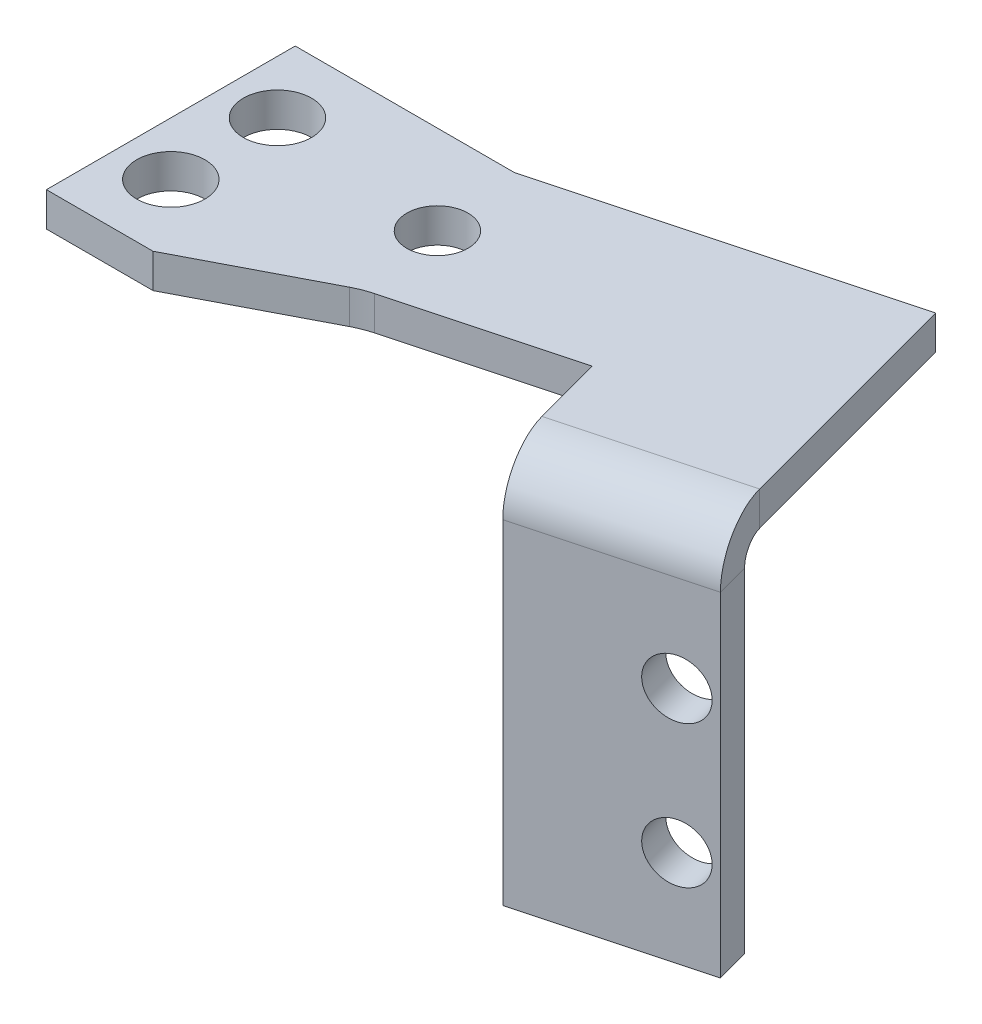
ISO-10303-21;
HEADER;
FILE_DESCRIPTION(('STEP AP214'),'2;1');
FILE_NAME('part.step','',(''),(''),'','','');
FILE_SCHEMA(('AUTOMOTIVE_DESIGN { 1 0 10303 214 1 1 1 1 }'));
ENDSEC;
DATA;
#1=APPLICATION_CONTEXT('core data for automotive mechanical design processes');
#2=APPLICATION_PROTOCOL_DEFINITION('international standard','automotive_design',2000,#1);
#3=PRODUCT_CONTEXT('',#1,'mechanical');
#4=PRODUCT('Part','Part','',(#3));
#5=PRODUCT_RELATED_PRODUCT_CATEGORY('part','',(#4));
#6=PRODUCT_DEFINITION_FORMATION('','',#4);
#7=PRODUCT_DEFINITION_CONTEXT('part definition',#1,'design');
#8=PRODUCT_DEFINITION('design','',#6,#7);
#9=PRODUCT_DEFINITION_SHAPE('','',#8);
#10=(LENGTH_UNIT() NAMED_UNIT(*) SI_UNIT(.MILLI.,.METRE.));
#11=(NAMED_UNIT(*) PLANE_ANGLE_UNIT() SI_UNIT($,.RADIAN.));
#12=(NAMED_UNIT(*) SI_UNIT($,.STERADIAN.) SOLID_ANGLE_UNIT());
#13=UNCERTAINTY_MEASURE_WITH_UNIT(LENGTH_MEASURE(1.E-05),#10,'distance_accuracy_value','');
#14=(GEOMETRIC_REPRESENTATION_CONTEXT(3) GLOBAL_UNCERTAINTY_ASSIGNED_CONTEXT((#13)) GLOBAL_UNIT_ASSIGNED_CONTEXT((#10,
#11,#12)) REPRESENTATION_CONTEXT('',''));
#15=CARTESIAN_POINT('',(0.,0.,0.));
#16=DIRECTION('',(0.,0.,1.));
#17=DIRECTION('',(1.,0.,0.));
#18=AXIS2_PLACEMENT_3D('',#15,#16,#17);
#19=CARTESIAN_POINT('',(17.5340084620717,-1.2192,-3.39518737433423));
#20=DIRECTION('',(0.258819045102522,0.,0.965925826289068));
#21=DIRECTION('',(0.965925826289068,0.,-0.258819045102522));
#22=AXIS2_PLACEMENT_3D('',#19,#20,#21);
#23=PLANE('',#22);
#24=DIRECTION('',(0.965925826289068,0.,-0.258819045102522));
#25=VECTOR('',#24,1.);
#26=CARTESIAN_POINT('',(17.5340084620717,-1.2192,-3.39518737433423));
#27=LINE('',#26,#25);
#28=CARTESIAN_POINT('',(5.26675046820051,-1.2192,-0.108185501532209));
#29=VERTEX_POINT('',#28);
#30=CARTESIAN_POINT('',(11.4003794651361,-1.21919999999999,-1.75168643793322));
#31=VERTEX_POINT('',#30);
#32=EDGE_CURVE('E140',#29,#31,#27,.T.);
#33=ORIENTED_EDGE('',*,*,#32,.T.);
#34=DIRECTION('',(0.,1.,0.));
#35=VECTOR('',#34,1.);
#36=CARTESIAN_POINT('',(11.4003794651361,-1.21919999999999,-1.75168643793322));
#37=LINE('',#36,#35);
#38=CARTESIAN_POINT('',(11.4003794651361,0.,-1.75168643793322));
#39=VERTEX_POINT('',#38);
#40=EDGE_CURVE('E232',#31,#39,#37,.T.);
#41=ORIENTED_EDGE('',*,*,#40,.T.);
#42=DIRECTION('',(0.965925826289068,0.,-0.258819045102522));
#43=VECTOR('',#42,1.);
#44=CARTESIAN_POINT('',(17.5340084620717,0.,-3.39518737433423));
#45=LINE('',#44,#43);
#46=CARTESIAN_POINT('',(5.26675046820051,0.,-0.108185501532209));
#47=VERTEX_POINT('',#46);
#48=EDGE_CURVE('E142',#47,#39,#45,.T.);
#49=ORIENTED_EDGE('',*,*,#48,.F.);
#50=DIRECTION('',(0.,1.,0.));
#51=VECTOR('',#50,1.);
#52=CARTESIAN_POINT('',(5.26675046820051,-1.2192,-0.108185501532209));
#53=LINE('',#52,#51);
#54=EDGE_CURVE('E138',#29,#47,#53,.T.);
#55=ORIENTED_EDGE('',*,*,#54,.F.);
#56=EDGE_LOOP('',(#33,#41,#49,#55));
#57=FACE_BOUND('',#56,.T.);
#58=ADVANCED_FACE('F61',(#57),#23,.T.);
#59=CARTESIAN_POINT('',(4.02700332016001,-1.2192,-6.35));
#60=DIRECTION('',(0.,0.,-1.));
#61=DIRECTION('',(-1.,0.,0.));
#62=AXIS2_PLACEMENT_3D('',#59,#60,#61);
#63=PLANE('',#62);
#64=DIRECTION('',(-1.,0.,0.));
#65=VECTOR('',#64,1.);
#66=CARTESIAN_POINT('',(4.02700332016001,0.,-6.35));
#67=LINE('',#66,#65);
#68=CARTESIAN_POINT('',(4.02700332016001,0.,-6.35));
#69=VERTEX_POINT('',#68);
#70=CARTESIAN_POINT('',(-3.81,0.,-6.35));
#71=VERTEX_POINT('',#70);
#72=EDGE_CURVE('E172',#69,#71,#67,.T.);
#73=ORIENTED_EDGE('',*,*,#72,.F.);
#74=DIRECTION('',(0.,1.,0.));
#75=VECTOR('',#74,1.);
#76=CARTESIAN_POINT('',(4.02700332016001,-1.2192,-6.35));
#77=LINE('',#76,#75);
#78=CARTESIAN_POINT('',(4.02700332016001,-1.2192,-6.35));
#79=VERTEX_POINT('',#78);
#80=EDGE_CURVE('E13',#79,#69,#77,.T.);
#81=ORIENTED_EDGE('',*,*,#80,.F.);
#82=DIRECTION('',(-1.,0.,0.));
#83=VECTOR('',#82,1.);
#84=CARTESIAN_POINT('',(4.02700332016001,-1.2192,-6.35));
#85=LINE('',#84,#83);
#86=CARTESIAN_POINT('',(-3.81,-1.2192,-6.35));
#87=VERTEX_POINT('',#86);
#88=EDGE_CURVE('E193',#79,#87,#85,.T.);
#89=ORIENTED_EDGE('',*,*,#88,.T.);
#90=DIRECTION('',(0.,1.,0.));
#91=VECTOR('',#90,1.);
#92=CARTESIAN_POINT('',(-3.81,-1.2192,-6.35));
#93=LINE('',#92,#91);
#94=EDGE_CURVE('E121',#87,#71,#93,.T.);
#95=ORIENTED_EDGE('',*,*,#94,.T.);
#96=EDGE_LOOP('',(#73,#81,#89,#95));
#97=FACE_BOUND('',#96,.T.);
#98=ADVANCED_FACE('F63',(#97),#63,.T.);
#99=CARTESIAN_POINT('',(4.02700332016001,-1.2192,-6.35));
#100=DIRECTION('',(-0.258819045102522,0.,-0.965925826289068));
#101=DIRECTION('',(-0.965925826289068,0.,0.258819045102522));
#102=AXIS2_PLACEMENT_3D('',#99,#100,#101);
#103=PLANE('',#102);
#104=DIRECTION('',(-0.965925826289068,0.,0.258819045102522));
#105=VECTOR('',#104,1.);
#106=CARTESIAN_POINT('',(4.02700332016001,0.,-6.35));
#107=LINE('',#106,#105);
#108=CARTESIAN_POINT('',(15.8905075256707,0.,-9.52881637126982));
#109=VERTEX_POINT('',#108);
#110=EDGE_CURVE('E191',#109,#69,#107,.T.);
#111=ORIENTED_EDGE('',*,*,#110,.F.);
#112=DIRECTION('',(0.,1.,0.));
#113=VECTOR('',#112,1.);
#114=CARTESIAN_POINT('',(15.8905075256707,-1.2192,-9.52881637126982));
#115=LINE('',#114,#113);
#116=CARTESIAN_POINT('',(15.8905075256707,-1.2192,-9.52881637126982));
#117=VERTEX_POINT('',#116);
#118=EDGE_CURVE('E70',#117,#109,#115,.T.);
#119=ORIENTED_EDGE('',*,*,#118,.F.);
#120=DIRECTION('',(-0.965925826289068,0.,0.258819045102522));
#121=VECTOR('',#120,1.);
#122=CARTESIAN_POINT('',(4.02700332016001,-1.2192,-6.35));
#123=LINE('',#122,#121);
#124=EDGE_CURVE('E170',#117,#79,#123,.T.);
#125=ORIENTED_EDGE('',*,*,#124,.T.);
#126=ORIENTED_EDGE('',*,*,#80,.T.);
#127=EDGE_LOOP('',(#111,#119,#125,#126));
#128=FACE_BOUND('',#127,.T.);
#129=ADVANCED_FACE('F206',(#128),#103,.T.);
#130=CARTESIAN_POINT('',(15.8905075256707,-1.2192,-9.52881637126982));
#131=DIRECTION('',(0.965925826289068,0.,-0.258819045102522));
#132=DIRECTION('',(-0.258819045102522,0.,-0.965925826289068));
#133=AXIS2_PLACEMENT_3D('',#130,#131,#132);
#134=PLANE('',#133);
#135=DIRECTION('',(-0.258819045102522,0.,-0.965925826289068));
#136=VECTOR('',#135,1.);
#137=CARTESIAN_POINT('',(15.8905075256707,0.,-9.52881637126982));
#138=LINE('',#137,#136);
#139=CARTESIAN_POINT('',(18.1914088366321,0.,-0.941735775560001));
#140=VERTEX_POINT('',#139);
#141=EDGE_CURVE('E188',#140,#109,#138,.T.);
#142=ORIENTED_EDGE('',*,*,#141,.F.);
#143=DIRECTION('',(0.,1.,0.));
#144=VECTOR('',#143,1.);
#145=CARTESIAN_POINT('',(18.1914088366321,-1.2192,-0.941735775560002));
#146=LINE('',#145,#144);
#147=CARTESIAN_POINT('',(18.1914088366321,-1.2192,-0.941735775560002));
#148=VERTEX_POINT('',#147);
#149=EDGE_CURVE('E214',#148,#140,#146,.T.);
#150=ORIENTED_EDGE('',*,*,#149,.F.);
#151=DIRECTION('',(-0.258819045102522,0.,-0.965925826289068));
#152=VECTOR('',#151,1.);
#153=CARTESIAN_POINT('',(15.8905075256707,-1.2192,-9.52881637126982));
#154=LINE('',#153,#152);
#155=EDGE_CURVE('E159',#148,#117,#154,.T.);
#156=ORIENTED_EDGE('',*,*,#155,.T.);
#157=ORIENTED_EDGE('',*,*,#118,.T.);
#158=EDGE_LOOP('',(#142,#150,#156,#157));
#159=FACE_BOUND('',#158,.T.);
#160=ADVANCED_FACE('F211',(#159),#134,.T.);
#161=CARTESIAN_POINT('',(6.08850093640101,-1.2192,2.95862899693558));
#162=DIRECTION('',(0.,1.,0.));
#163=DIRECTION('',(0.,0.,1.));
#164=AXIS2_PLACEMENT_3D('',#161,#162,#163);
#165=CYLINDRICAL_SURFACE('',#164,3.175);
#166=CARTESIAN_POINT('',(6.08850093640101,0.,2.95862899693558));
#167=DIRECTION('',(0.,-1.,0.));
#168=DIRECTION('',(0.,0.,1.));
#169=AXIS2_PLACEMENT_3D('',#166,#167,#168);
#170=CIRCLE('',#169,3.175);
#171=CARTESIAN_POINT('',(4.62660528405092,0.,0.14020991850883));
#172=VERTEX_POINT('',#171);
#173=EDGE_CURVE('E185',#172,#47,#170,.T.);
#174=ORIENTED_EDGE('',*,*,#173,.F.);
#175=DIRECTION('',(0.,1.,0.));
#176=VECTOR('',#175,1.);
#177=CARTESIAN_POINT('',(4.62660528405092,-1.2192,0.14020991850883));
#178=LINE('',#177,#176);
#179=CARTESIAN_POINT('',(4.62660528405092,-1.2192,0.14020991850883));
#180=VERTEX_POINT('',#179);
#181=EDGE_CURVE('E147',#180,#172,#178,.T.);
#182=ORIENTED_EDGE('',*,*,#181,.F.);
#183=CARTESIAN_POINT('',(6.08850093640101,-1.2192,2.95862899693558));
#184=DIRECTION('',(0.,-1.,0.));
#185=DIRECTION('',(0.,0.,1.));
#186=AXIS2_PLACEMENT_3D('',#183,#184,#185);
#187=CIRCLE('',#186,3.175);
#188=EDGE_CURVE('E154',#180,#29,#187,.T.);
#189=ORIENTED_EDGE('',*,*,#188,.T.);
#190=ORIENTED_EDGE('',*,*,#54,.T.);
#191=EDGE_LOOP('',(#174,#182,#189,#190));
#192=FACE_BOUND('',#191,.T.);
#193=ADVANCED_FACE('F161',(#192),#165,.F.);
#194=CARTESIAN_POINT('',(0.,-1.2192,2.54));
#195=DIRECTION('',(0.460439575543336,0.,0.887691048323386));
#196=DIRECTION('',(0.887691048323386,0.,-0.460439575543336));
#197=AXIS2_PLACEMENT_3D('',#194,#195,#196);
#198=PLANE('',#197);
#199=DIRECTION('',(0.887691048323386,0.,-0.460439575543336));
#200=VECTOR('',#199,1.);
#201=CARTESIAN_POINT('',(0.,0.,2.54));
#202=LINE('',#201,#200);
#203=CARTESIAN_POINT('',(0.,0.,2.54));
#204=VERTEX_POINT('',#203);
#205=EDGE_CURVE('E182',#204,#172,#202,.T.);
#206=ORIENTED_EDGE('',*,*,#205,.F.);
#207=DIRECTION('',(0.,1.,0.));
#208=VECTOR('',#207,1.);
#209=CARTESIAN_POINT('',(0.,-1.2192,2.54));
#210=LINE('',#209,#208);
#211=CARTESIAN_POINT('',(0.,-1.2192,2.54));
#212=VERTEX_POINT('',#211);
#213=EDGE_CURVE('E197',#212,#204,#210,.T.);
#214=ORIENTED_EDGE('',*,*,#213,.F.);
#215=DIRECTION('',(0.887691048323386,0.,-0.460439575543336));
#216=VECTOR('',#215,1.);
#217=CARTESIAN_POINT('',(0.,-1.2192,2.54));
#218=LINE('',#217,#216);
#219=EDGE_CURVE('E162',#212,#180,#218,.T.);
#220=ORIENTED_EDGE('',*,*,#219,.T.);
#221=ORIENTED_EDGE('',*,*,#181,.T.);
#222=EDGE_LOOP('',(#206,#214,#220,#221));
#223=FACE_BOUND('',#222,.T.);
#224=ADVANCED_FACE('F226',(#223),#198,.T.);
#225=CARTESIAN_POINT('',(0.,-1.2192,2.54));
#226=DIRECTION('',(0.,0.,1.));
#227=DIRECTION('',(1.,0.,0.));
#228=AXIS2_PLACEMENT_3D('',#225,#226,#227);
#229=PLANE('',#228);
#230=DIRECTION('',(1.,0.,0.));
#231=VECTOR('',#230,1.);
#232=CARTESIAN_POINT('',(0.,0.,2.54));
#233=LINE('',#232,#231);
#234=CARTESIAN_POINT('',(-3.81,0.,2.54));
#235=VERTEX_POINT('',#234);
#236=EDGE_CURVE('E179',#235,#204,#233,.T.);
#237=ORIENTED_EDGE('',*,*,#236,.F.);
#238=DIRECTION('',(0.,1.,0.));
#239=VECTOR('',#238,1.);
#240=CARTESIAN_POINT('',(-3.81,-1.2192,2.54));
#241=LINE('',#240,#239);
#242=CARTESIAN_POINT('',(-3.81,-1.2192,2.54));
#243=VERTEX_POINT('',#242);
#244=EDGE_CURVE('E199',#243,#235,#241,.T.);
#245=ORIENTED_EDGE('',*,*,#244,.F.);
#246=DIRECTION('',(1.,0.,0.));
#247=VECTOR('',#246,1.);
#248=CARTESIAN_POINT('',(0.,-1.2192,2.54));
#249=LINE('',#248,#247);
#250=EDGE_CURVE('E164',#243,#212,#249,.T.);
#251=ORIENTED_EDGE('',*,*,#250,.T.);
#252=ORIENTED_EDGE('',*,*,#213,.T.);
#253=EDGE_LOOP('',(#237,#245,#251,#252));
#254=FACE_BOUND('',#253,.T.);
#255=ADVANCED_FACE('F223',(#254),#229,.T.);
#256=CARTESIAN_POINT('',(-3.81,-1.2192,-6.35));
#257=DIRECTION('',(-1.,0.,0.));
#258=DIRECTION('',(0.,0.,1.));
#259=AXIS2_PLACEMENT_3D('',#256,#257,#258);
#260=PLANE('',#259);
#261=DIRECTION('',(0.,0.,1.));
#262=VECTOR('',#261,1.);
#263=CARTESIAN_POINT('',(-3.81,0.,-6.35));
#264=LINE('',#263,#262);
#265=EDGE_CURVE('E175',#71,#235,#264,.T.);
#266=ORIENTED_EDGE('',*,*,#265,.F.);
#267=ORIENTED_EDGE('',*,*,#94,.F.);
#268=DIRECTION('',(0.,0.,1.));
#269=VECTOR('',#268,1.);
#270=CARTESIAN_POINT('',(-3.81,-1.2192,-6.35));
#271=LINE('',#270,#269);
#272=EDGE_CURVE('E216',#87,#243,#271,.T.);
#273=ORIENTED_EDGE('',*,*,#272,.T.);
#274=ORIENTED_EDGE('',*,*,#244,.T.);
#275=EDGE_LOOP('',(#266,#267,#273,#274));
#276=FACE_BOUND('',#275,.T.);
#277=ADVANCED_FACE('F200',(#276),#260,.T.);
#278=CARTESIAN_POINT('',(6.08850093640101,-1.2192,2.95862899693558));
#279=DIRECTION('',(0.,1.,0.));
#280=DIRECTION('',(0.,0.,1.));
#281=AXIS2_PLACEMENT_3D('',#278,#279,#280);
#282=PLANE('',#281);
#283=CARTESIAN_POINT('',(-1.905,-1.2192,0.));
#284=DIRECTION('',(0.,1.,0.));
#285=DIRECTION('',(0.,0.,1.));
#286=AXIS2_PLACEMENT_3D('',#283,#284,#285);
#287=CIRCLE('',#286,1.21919999999999);
#288=CARTESIAN_POINT('',(-1.905,-1.2192,1.21919999999999));
#289=VERTEX_POINT('',#288);
#290=EDGE_CURVE('E495',#289,#289,#287,.T.);
#291=ORIENTED_EDGE('',*,*,#290,.T.);
#292=EDGE_LOOP('',(#291));
#293=FACE_BOUND('',#292,.T.);
#294=CARTESIAN_POINT('',(-1.905,-1.2192,-3.81));
#295=DIRECTION('',(0.,1.,0.));
#296=DIRECTION('',(0.,0.,1.));
#297=AXIS2_PLACEMENT_3D('',#294,#295,#296);
#298=CIRCLE('',#297,1.21919999999999);
#299=CARTESIAN_POINT('',(-1.905,-1.2192,-2.59080000000001));
#300=VERTEX_POINT('',#299);
#301=EDGE_CURVE('E499',#300,#300,#298,.T.);
#302=ORIENTED_EDGE('',*,*,#301,.T.);
#303=EDGE_LOOP('',(#302));
#304=FACE_BOUND('',#303,.T.);
#305=CARTESIAN_POINT('',(4.445,-1.2192,-3.175));
#306=DIRECTION('',(0.,1.,0.));
#307=DIRECTION('',(0.,0.,1.));
#308=AXIS2_PLACEMENT_3D('',#305,#306,#307);
#309=CIRCLE('',#308,1.0922);
#310=CARTESIAN_POINT('',(4.445,-1.2192,-2.0828));
#311=VERTEX_POINT('',#310);
#312=EDGE_CURVE('E176',#311,#311,#309,.T.);
#313=ORIENTED_EDGE('',*,*,#312,.T.);
#314=EDGE_LOOP('',(#313));
#315=FACE_BOUND('',#314,.T.);
#316=ORIENTED_EDGE('',*,*,#88,.F.);
#317=ORIENTED_EDGE('',*,*,#124,.F.);
#318=ORIENTED_EDGE('',*,*,#155,.F.);
#319=DIRECTION('',(-0.965925826289068,0.,0.258819045102522));
#320=VECTOR('',#319,1.);
#321=CARTESIAN_POINT('',(12.0577798396965,-1.2192,0.701765160841011));
#322=LINE('',#321,#320);
#323=CARTESIAN_POINT('',(12.0577798396965,-1.2192,0.701765160841011));
#324=VERTEX_POINT('',#323);
#325=EDGE_CURVE('E557',#324,#148,#322,.F.);
#326=ORIENTED_EDGE('',*,*,#325,.F.);
#327=DIRECTION('',(-0.258819045102522,0.,-0.965925826289068));
#328=VECTOR('',#327,1.);
#329=CARTESIAN_POINT('',(12.0577798396965,-1.2192,0.701765160841011));
#330=LINE('',#329,#328);
#331=EDGE_CURVE('E158',#324,#31,#330,.T.);
#332=ORIENTED_EDGE('',*,*,#331,.T.);
#333=ORIENTED_EDGE('',*,*,#32,.F.);
#334=ORIENTED_EDGE('',*,*,#188,.F.);
#335=ORIENTED_EDGE('',*,*,#219,.F.);
#336=ORIENTED_EDGE('',*,*,#250,.F.);
#337=ORIENTED_EDGE('',*,*,#272,.F.);
#338=EDGE_LOOP('',(#316,#317,#318,#326,#332,#333,#334,#335,#336,#337));
#339=FACE_BOUND('',#338,.T.);
#340=ADVANCED_FACE('F152',(#293,#304,#315,#339),#282,.F.);
#341=CARTESIAN_POINT('',(6.08850093640101,0.,2.95862899693558));
#342=DIRECTION('',(0.,1.,0.));
#343=DIRECTION('',(0.,0.,1.));
#344=AXIS2_PLACEMENT_3D('',#341,#342,#343);
#345=PLANE('',#344);
#346=CARTESIAN_POINT('',(-1.905,0.,0.));
#347=DIRECTION('',(0.,1.,0.));
#348=DIRECTION('',(0.,0.,1.));
#349=AXIS2_PLACEMENT_3D('',#346,#347,#348);
#350=CIRCLE('',#349,1.21919999999999);
#351=CARTESIAN_POINT('',(-1.905,0.,1.21919999999999));
#352=VERTEX_POINT('',#351);
#353=EDGE_CURVE('E493',#352,#352,#350,.T.);
#354=ORIENTED_EDGE('',*,*,#353,.F.);
#355=EDGE_LOOP('',(#354));
#356=FACE_BOUND('',#355,.T.);
#357=CARTESIAN_POINT('',(-1.905,0.,-3.81));
#358=DIRECTION('',(0.,1.,0.));
#359=DIRECTION('',(0.,0.,1.));
#360=AXIS2_PLACEMENT_3D('',#357,#358,#359);
#361=CIRCLE('',#360,1.21919999999999);
#362=CARTESIAN_POINT('',(-1.905,0.,-2.59080000000001));
#363=VERTEX_POINT('',#362);
#364=EDGE_CURVE('E496',#363,#363,#361,.T.);
#365=ORIENTED_EDGE('',*,*,#364,.F.);
#366=EDGE_LOOP('',(#365));
#367=FACE_BOUND('',#366,.T.);
#368=CARTESIAN_POINT('',(4.445,0.,-3.175));
#369=DIRECTION('',(0.,1.,0.));
#370=DIRECTION('',(0.,0.,1.));
#371=AXIS2_PLACEMENT_3D('',#368,#369,#370);
#372=CIRCLE('',#371,1.0922);
#373=CARTESIAN_POINT('',(4.445,0.,-2.0828));
#374=VERTEX_POINT('',#373);
#375=EDGE_CURVE('E250',#374,#374,#372,.T.);
#376=ORIENTED_EDGE('',*,*,#375,.F.);
#377=EDGE_LOOP('',(#376));
#378=FACE_BOUND('',#377,.T.);
#379=ORIENTED_EDGE('',*,*,#72,.T.);
#380=ORIENTED_EDGE('',*,*,#265,.T.);
#381=ORIENTED_EDGE('',*,*,#236,.T.);
#382=ORIENTED_EDGE('',*,*,#205,.T.);
#383=ORIENTED_EDGE('',*,*,#173,.T.);
#384=ORIENTED_EDGE('',*,*,#48,.T.);
#385=DIRECTION('',(-0.258819045102522,0.,-0.965925826289068));
#386=VECTOR('',#385,1.);
#387=CARTESIAN_POINT('',(12.0577798396965,0.,0.701765160841012));
#388=LINE('',#387,#386);
#389=CARTESIAN_POINT('',(12.0577798396965,0.,0.701765160841012));
#390=VERTEX_POINT('',#389);
#391=EDGE_CURVE('E78',#390,#39,#388,.T.);
#392=ORIENTED_EDGE('',*,*,#391,.F.);
#393=DIRECTION('',(-0.965925826289068,0.,0.258819045102522));
#394=VECTOR('',#393,1.);
#395=CARTESIAN_POINT('',(12.0577798396965,0.,0.701765160841012));
#396=LINE('',#395,#394);
#397=EDGE_CURVE('E229',#390,#140,#396,.F.);
#398=ORIENTED_EDGE('',*,*,#397,.T.);
#399=ORIENTED_EDGE('',*,*,#141,.T.);
#400=ORIENTED_EDGE('',*,*,#110,.T.);
#401=EDGE_LOOP('',(#379,#380,#381,#382,#383,#384,#392,#398,#399,#400));
#402=FACE_BOUND('',#401,.T.);
#403=ADVANCED_FACE('F203',(#356,#367,#378,#402),#345,.T.);
#404=CARTESIAN_POINT('',(4.445,-2.54,-3.175));
#405=DIRECTION('',(0.,1.,0.));
#406=DIRECTION('',(0.,0.,1.));
#407=AXIS2_PLACEMENT_3D('',#404,#405,#406);
#408=CYLINDRICAL_SURFACE('',#407,1.0922);
#409=ORIENTED_EDGE('',*,*,#375,.T.);
#410=EDGE_LOOP('',(#409));
#411=FACE_BOUND('',#410,.T.);
#412=ORIENTED_EDGE('',*,*,#312,.F.);
#413=EDGE_LOOP('',(#412));
#414=FACE_BOUND('',#413,.T.);
#415=ADVANCED_FACE('F258',(#411,#414),#408,.F.);
#416=CARTESIAN_POINT('',(12.0577798396965,-1.2192,0.701765160841011));
#417=DIRECTION('',(-0.965925826289068,0.,0.258819045102522));
#418=DIRECTION('',(0.,1.,0.));
#419=AXIS2_PLACEMENT_3D('',#416,#417,#418);
#420=PLANE('',#419);
#421=ORIENTED_EDGE('',*,*,#331,.F.);
#422=DIRECTION('',(0.,1.,0.));
#423=VECTOR('',#422,1.);
#424=CARTESIAN_POINT('',(12.0577798396965,-1.2192,0.701765160841011));
#425=LINE('',#424,#423);
#426=EDGE_CURVE('E235',#324,#390,#425,.T.);
#427=ORIENTED_EDGE('',*,*,#426,.T.);
#428=ORIENTED_EDGE('',*,*,#391,.T.);
#429=ORIENTED_EDGE('',*,*,#40,.F.);
#430=EDGE_LOOP('',(#421,#427,#428,#429));
#431=FACE_BOUND('',#430,.T.);
#432=ADVANCED_FACE('F236',(#431),#420,.T.);
#433=CARTESIAN_POINT('',(18.1914088366321,-1.9812,-0.941735775560002));
#434=DIRECTION('',(0.965925826289068,0.,-0.258819045102522));
#435=DIRECTION('',(-0.258819045102522,0.,-0.965925826289068));
#436=AXIS2_PLACEMENT_3D('',#433,#434,#435);
#437=PLANE('',#436);
#438=DIRECTION('',(-0.258819045102522,0.,-0.965925826289068));
#439=VECTOR('',#438,1.);
#440=CARTESIAN_POINT('',(18.7041811287892,-1.98119999999999,0.9719564714839));
#441=LINE('',#440,#439);
#442=CARTESIAN_POINT('',(18.3886289490002,-1.9812,-0.205700295927731));
#443=VERTEX_POINT('',#442);
#444=CARTESIAN_POINT('',(18.7041811287892,-1.98119999999999,0.971956471483901));
#445=VERTEX_POINT('',#444);
#446=EDGE_CURVE('E548',#443,#445,#441,.F.);
#447=ORIENTED_EDGE('',*,*,#446,.F.);
#448=CARTESIAN_POINT('',(18.1914088366321,-1.9812,-0.941735775560002));
#449=DIRECTION('',(-0.965925826289068,0.,0.258819045102522));
#450=DIRECTION('',(0.258819045102522,0.,0.965925826289068));
#451=AXIS2_PLACEMENT_3D('',#448,#449,#450);
#452=CIRCLE('',#451,0.762000000000001);
#453=EDGE_CURVE('E554',#148,#443,#452,.F.);
#454=ORIENTED_EDGE('',*,*,#453,.F.);
#455=ORIENTED_EDGE('',*,*,#149,.T.);
#456=CARTESIAN_POINT('',(18.1914088366321,-1.9812,-0.941735775560002));
#457=DIRECTION('',(-0.965925826289068,0.,0.258819045102522));
#458=DIRECTION('',(0.258819045102522,0.,0.965925826289068));
#459=AXIS2_PLACEMENT_3D('',#456,#457,#458);
#460=CIRCLE('',#459,1.9812);
#461=EDGE_CURVE('E242',#140,#445,#460,.F.);
#462=ORIENTED_EDGE('',*,*,#461,.T.);
#463=EDGE_LOOP('',(#447,#454,#455,#462));
#464=FACE_BOUND('',#463,.T.);
#465=ADVANCED_FACE('F265',(#464),#437,.T.);
#466=CARTESIAN_POINT('',(12.0577798396965,-1.9812,0.701765160841011));
#467=DIRECTION('',(0.965925826289068,0.,-0.258819045102522));
#468=DIRECTION('',(-0.258819045102522,0.,-0.965925826289068));
#469=AXIS2_PLACEMENT_3D('',#466,#467,#468);
#470=PLANE('',#469);
#471=CARTESIAN_POINT('',(12.0577798396965,-1.9812,0.701765160841011));
#472=DIRECTION('',(-0.965925826289068,0.,0.258819045102522));
#473=DIRECTION('',(0.258819045102522,0.,0.965925826289068));
#474=AXIS2_PLACEMENT_3D('',#471,#472,#473);
#475=CIRCLE('',#474,0.762000000000001);
#476=CARTESIAN_POINT('',(12.2549999520646,-1.98119999999999,1.43780064047328));
#477=VERTEX_POINT('',#476);
#478=EDGE_CURVE('E517',#477,#324,#475,.T.);
#479=ORIENTED_EDGE('',*,*,#478,.F.);
#480=DIRECTION('',(-0.258819045102522,0.,-0.965925826289068));
#481=VECTOR('',#480,1.);
#482=CARTESIAN_POINT('',(12.2549999520646,-1.98119999999999,1.43780064047328));
#483=LINE('',#482,#481);
#484=CARTESIAN_POINT('',(12.5705521318536,-1.98119999999999,2.61545740788491));
#485=VERTEX_POINT('',#484);
#486=EDGE_CURVE('E542',#477,#485,#483,.F.);
#487=ORIENTED_EDGE('',*,*,#486,.T.);
#488=CARTESIAN_POINT('',(12.0577798396965,-1.9812,0.701765160841011));
#489=DIRECTION('',(-0.965925826289068,0.,0.258819045102522));
#490=DIRECTION('',(0.258819045102522,0.,0.965925826289068));
#491=AXIS2_PLACEMENT_3D('',#488,#489,#490);
#492=CIRCLE('',#491,1.9812);
#493=EDGE_CURVE('E551',#485,#390,#492,.T.);
#494=ORIENTED_EDGE('',*,*,#493,.T.);
#495=ORIENTED_EDGE('',*,*,#426,.F.);
#496=EDGE_LOOP('',(#479,#487,#494,#495));
#497=FACE_BOUND('',#496,.T.);
#498=ADVANCED_FACE('F346',(#497),#470,.F.);
#499=CARTESIAN_POINT('',(12.0577798396965,-1.9812,0.701765160841011));
#500=DIRECTION('',(-0.965925826289068,0.,0.258819045102522));
#501=DIRECTION('',(0.258819045102522,0.,0.965925826289068));
#502=AXIS2_PLACEMENT_3D('',#499,#500,#501);
#503=CYLINDRICAL_SURFACE('',#502,1.9812);
#504=ORIENTED_EDGE('',*,*,#397,.F.);
#505=ORIENTED_EDGE('',*,*,#493,.F.);
#506=DIRECTION('',(-0.965925826289068,0.,0.258819045102522));
#507=VECTOR('',#506,1.);
#508=CARTESIAN_POINT('',(18.7041811287892,-1.98119999999999,0.971956471483899));
#509=LINE('',#508,#507);
#510=EDGE_CURVE('E539',#485,#445,#509,.F.);
#511=ORIENTED_EDGE('',*,*,#510,.T.);
#512=ORIENTED_EDGE('',*,*,#461,.F.);
#513=EDGE_LOOP('',(#504,#505,#511,#512));
#514=FACE_BOUND('',#513,.T.);
#515=ADVANCED_FACE('F356',(#514),#503,.T.);
#516=CARTESIAN_POINT('',(12.0577798396965,-1.9812,0.701765160841011));
#517=DIRECTION('',(-0.965925826289068,0.,0.258819045102522));
#518=DIRECTION('',(0.258819045102522,0.,0.965925826289068));
#519=AXIS2_PLACEMENT_3D('',#516,#517,#518);
#520=CYLINDRICAL_SURFACE('',#519,0.762000000000001);
#521=ORIENTED_EDGE('',*,*,#325,.T.);
#522=ORIENTED_EDGE('',*,*,#453,.T.);
#523=DIRECTION('',(-0.965925826289068,0.,0.258819045102522));
#524=VECTOR('',#523,1.);
#525=CARTESIAN_POINT('',(18.3886289490002,-1.9812,-0.205700295927733));
#526=LINE('',#525,#524);
#527=EDGE_CURVE('E545',#443,#477,#526,.T.);
#528=ORIENTED_EDGE('',*,*,#527,.T.);
#529=ORIENTED_EDGE('',*,*,#478,.T.);
#530=EDGE_LOOP('',(#521,#522,#528,#529));
#531=FACE_BOUND('',#530,.T.);
#532=ADVANCED_FACE('F365',(#531),#520,.F.);
#533=CARTESIAN_POINT('',(12.5705521318536,-13.9192,2.61545740788495));
#534=DIRECTION('',(0.965925826289068,0.,-0.258819045102522));
#535=DIRECTION('',(-0.258819045102522,0.,-0.965925826289068));
#536=AXIS2_PLACEMENT_3D('',#533,#534,#535);
#537=PLANE('',#536);
#538=ORIENTED_EDGE('',*,*,#486,.F.);
#539=DIRECTION('',(0.,1.,0.));
#540=VECTOR('',#539,1.);
#541=CARTESIAN_POINT('',(12.2549999520646,-13.9192,1.43780064047332));
#542=LINE('',#541,#540);
#543=CARTESIAN_POINT('',(12.2549999520646,-13.9192,1.43780064047332));
#544=VERTEX_POINT('',#543);
#545=EDGE_CURVE('E536',#477,#544,#542,.F.);
#546=ORIENTED_EDGE('',*,*,#545,.T.);
#547=DIRECTION('',(-0.258819045102522,0.,-0.965925826289068));
#548=VECTOR('',#547,1.);
#549=CARTESIAN_POINT('',(12.5705521318536,-13.9192,2.61545740788495));
#550=LINE('',#549,#548);
#551=CARTESIAN_POINT('',(12.5705521318536,-13.9192,2.61545740788495));
#552=VERTEX_POINT('',#551);
#553=EDGE_CURVE('E514',#552,#544,#550,.T.);
#554=ORIENTED_EDGE('',*,*,#553,.F.);
#555=DIRECTION('',(0.,-1.,0.));
#556=VECTOR('',#555,1.);
#557=CARTESIAN_POINT('',(12.5705521318536,0.,2.61545740788491));
#558=LINE('',#557,#556);
#559=EDGE_CURVE('E527',#485,#552,#558,.T.);
#560=ORIENTED_EDGE('',*,*,#559,.F.);
#561=EDGE_LOOP('',(#538,#546,#554,#560));
#562=FACE_BOUND('',#561,.T.);
#563=ADVANCED_FACE('F375',(#562),#537,.F.);
#564=CARTESIAN_POINT('',(18.7041811287892,-1.2192,0.971956471483897));
#565=DIRECTION('',(-0.965925826289068,0.,0.258819045102522));
#566=DIRECTION('',(0.258819045102522,0.,0.965925826289068));
#567=AXIS2_PLACEMENT_3D('',#564,#565,#566);
#568=PLANE('',#567);
#569=ORIENTED_EDGE('',*,*,#446,.T.);
#570=DIRECTION('',(0.,1.,0.));
#571=VECTOR('',#570,1.);
#572=CARTESIAN_POINT('',(18.7041811287892,0.,0.971956471483893));
#573=LINE('',#572,#571);
#574=CARTESIAN_POINT('',(18.7041811287892,-13.9192,0.971956471483941));
#575=VERTEX_POINT('',#574);
#576=EDGE_CURVE('E521',#575,#445,#573,.T.);
#577=ORIENTED_EDGE('',*,*,#576,.F.);
#578=DIRECTION('',(-0.258819045102522,0.,-0.965925826289068));
#579=VECTOR('',#578,1.);
#580=CARTESIAN_POINT('',(18.7041811287892,-13.9192,0.97195647148394));
#581=LINE('',#580,#579);
#582=CARTESIAN_POINT('',(18.3886289490002,-13.9192,-0.20570029592769));
#583=VERTEX_POINT('',#582);
#584=EDGE_CURVE('E518',#575,#583,#581,.T.);
#585=ORIENTED_EDGE('',*,*,#584,.T.);
#586=DIRECTION('',(0.,-1.,0.));
#587=VECTOR('',#586,1.);
#588=CARTESIAN_POINT('',(18.3886289490002,-1.2192,-0.205700295927734));
#589=LINE('',#588,#587);
#590=EDGE_CURVE('E530',#583,#443,#589,.F.);
#591=ORIENTED_EDGE('',*,*,#590,.T.);
#592=EDGE_LOOP('',(#569,#577,#585,#591));
#593=FACE_BOUND('',#592,.T.);
#594=ADVANCED_FACE('F385',(#593),#568,.F.);
#595=CARTESIAN_POINT('',(1.49593167500711,0.,5.58289301577813));
#596=DIRECTION('',(-0.258819045102522,0.,-0.965925826289068));
#597=DIRECTION('',(-0.965925826289068,0.,0.258819045102522));
#598=AXIS2_PLACEMENT_3D('',#595,#596,#597);
#599=PLANE('',#598);
#600=CARTESIAN_POINT('',(17.4774553294021,-10.4902,1.30065665876413));
#601=DIRECTION('',(-0.258819045102522,0.,-0.965925826289068));
#602=DIRECTION('',(-0.965925826289068,0.,0.258819045102522));
#603=AXIS2_PLACEMENT_3D('',#600,#601,#602);
#604=CIRCLE('',#603,1.02869999999999);
#605=CARTESIAN_POINT('',(16.4838074318985,-10.4902,1.56690381046109));
#606=VERTEX_POINT('',#605);
#607=EDGE_CURVE('E508',#606,#606,#604,.T.);
#608=ORIENTED_EDGE('',*,*,#607,.T.);
#609=EDGE_LOOP('',(#608));
#610=FACE_BOUND('',#609,.T.);
#611=CARTESIAN_POINT('',(17.4774553294021,-5.4102,1.30065665876411));
#612=DIRECTION('',(-0.258819045102522,0.,-0.965925826289068));
#613=DIRECTION('',(-0.965925826289068,0.,0.258819045102522));
#614=AXIS2_PLACEMENT_3D('',#611,#612,#613);
#615=CIRCLE('',#614,1.02869999999999);
#616=CARTESIAN_POINT('',(16.4838074318985,-5.4102,1.56690381046108));
#617=VERTEX_POINT('',#616);
#618=EDGE_CURVE('E65',#617,#617,#615,.T.);
#619=ORIENTED_EDGE('',*,*,#618,.T.);
#620=EDGE_LOOP('',(#619));
#621=FACE_BOUND('',#620,.T.);
#622=ORIENTED_EDGE('',*,*,#510,.F.);
#623=ORIENTED_EDGE('',*,*,#559,.T.);
#624=DIRECTION('',(0.965925826289068,0.,-0.258819045102522));
#625=VECTOR('',#624,1.);
#626=CARTESIAN_POINT('',(1.49593167500712,-13.9192,5.58289301577817));
#627=LINE('',#626,#625);
#628=EDGE_CURVE('E524',#552,#575,#627,.T.);
#629=ORIENTED_EDGE('',*,*,#628,.T.);
#630=ORIENTED_EDGE('',*,*,#576,.T.);
#631=EDGE_LOOP('',(#622,#623,#629,#630));
#632=FACE_BOUND('',#631,.T.);
#633=ADVANCED_FACE('F395',(#610,#621,#632),#599,.F.);
#634=CARTESIAN_POINT('',(1.18037949521812,0.,4.4052362483665));
#635=DIRECTION('',(-0.258819045102522,0.,-0.965925826289068));
#636=DIRECTION('',(-0.965925826289068,0.,0.258819045102522));
#637=AXIS2_PLACEMENT_3D('',#634,#635,#636);
#638=PLANE('',#637);
#639=CARTESIAN_POINT('',(17.1619031496131,-10.4902,0.122999891352497));
#640=DIRECTION('',(-0.258819045102522,0.,-0.965925826289068));
#641=DIRECTION('',(-0.965925826289068,0.,0.258819045102522));
#642=AXIS2_PLACEMENT_3D('',#639,#640,#641);
#643=CIRCLE('',#642,1.02869999999999);
#644=CARTESIAN_POINT('',(16.1682552521095,-10.4902,0.389247043049458));
#645=VERTEX_POINT('',#644);
#646=EDGE_CURVE('E505',#645,#645,#643,.T.);
#647=ORIENTED_EDGE('',*,*,#646,.F.);
#648=EDGE_LOOP('',(#647));
#649=FACE_BOUND('',#648,.T.);
#650=CARTESIAN_POINT('',(17.1619031496131,-5.4102,0.122999891352497));
#651=DIRECTION('',(-0.258819045102522,0.,-0.965925826289068));
#652=DIRECTION('',(-0.965925826289068,0.,0.258819045102522));
#653=AXIS2_PLACEMENT_3D('',#650,#651,#652);
#654=CIRCLE('',#653,1.02869999999999);
#655=CARTESIAN_POINT('',(16.1682552521095,-5.4102,0.389247043049458));
#656=VERTEX_POINT('',#655);
#657=EDGE_CURVE('E511',#656,#656,#654,.T.);
#658=ORIENTED_EDGE('',*,*,#657,.F.);
#659=EDGE_LOOP('',(#658));
#660=FACE_BOUND('',#659,.T.);
#661=ORIENTED_EDGE('',*,*,#545,.F.);
#662=ORIENTED_EDGE('',*,*,#527,.F.);
#663=ORIENTED_EDGE('',*,*,#590,.F.);
#664=DIRECTION('',(-0.965925826289068,0.,0.258819045102522));
#665=VECTOR('',#664,1.);
#666=CARTESIAN_POINT('',(18.3886289490002,-13.9192,-0.20570029592769));
#667=LINE('',#666,#665);
#668=EDGE_CURVE('E533',#544,#583,#667,.F.);
#669=ORIENTED_EDGE('',*,*,#668,.F.);
#670=EDGE_LOOP('',(#661,#662,#663,#669));
#671=FACE_BOUND('',#670,.T.);
#672=ADVANCED_FACE('F405',(#649,#660,#671),#638,.T.);
#673=CARTESIAN_POINT('',(18.7041811287892,-13.9192,0.971956471483939));
#674=DIRECTION('',(0.,1.,0.));
#675=DIRECTION('',(0.,0.,1.));
#676=AXIS2_PLACEMENT_3D('',#673,#674,#675);
#677=PLANE('',#676);
#678=ORIENTED_EDGE('',*,*,#668,.T.);
#679=ORIENTED_EDGE('',*,*,#584,.F.);
#680=ORIENTED_EDGE('',*,*,#628,.F.);
#681=ORIENTED_EDGE('',*,*,#553,.T.);
#682=EDGE_LOOP('',(#678,#679,#680,#681));
#683=FACE_BOUND('',#682,.T.);
#684=ADVANCED_FACE('F415',(#683),#677,.F.);
#685=CARTESIAN_POINT('',(17.1619031496131,-5.4102,0.122999891352498));
#686=DIRECTION('',(-0.258819045102522,0.,-0.965925826289068));
#687=DIRECTION('',(-0.965925826289068,0.,0.258819045102522));
#688=AXIS2_PLACEMENT_3D('',#685,#686,#687);
#689=CYLINDRICAL_SURFACE('',#688,1.02869999999999);
#690=ORIENTED_EDGE('',*,*,#657,.T.);
#691=EDGE_LOOP('',(#690));
#692=FACE_BOUND('',#691,.T.);
#693=ORIENTED_EDGE('',*,*,#618,.F.);
#694=EDGE_LOOP('',(#693));
#695=FACE_BOUND('',#694,.T.);
#696=ADVANCED_FACE('F424',(#692,#695),#689,.F.);
#697=CARTESIAN_POINT('',(17.1619031496131,-10.4902,0.122999891352498));
#698=DIRECTION('',(-0.258819045102522,0.,-0.965925826289068));
#699=DIRECTION('',(-0.965925826289068,0.,0.258819045102522));
#700=AXIS2_PLACEMENT_3D('',#697,#698,#699);
#701=CYLINDRICAL_SURFACE('',#700,1.02869999999999);
#702=ORIENTED_EDGE('',*,*,#646,.T.);
#703=EDGE_LOOP('',(#702));
#704=FACE_BOUND('',#703,.T.);
#705=ORIENTED_EDGE('',*,*,#607,.F.);
#706=EDGE_LOOP('',(#705));
#707=FACE_BOUND('',#706,.T.);
#708=ADVANCED_FACE('F437',(#704,#707),#701,.F.);
#709=CARTESIAN_POINT('',(-1.905,0.,-3.81));
#710=DIRECTION('',(0.,1.,0.));
#711=DIRECTION('',(0.,0.,1.));
#712=AXIS2_PLACEMENT_3D('',#709,#710,#711);
#713=CYLINDRICAL_SURFACE('',#712,1.21919999999999);
#714=ORIENTED_EDGE('',*,*,#364,.T.);
#715=EDGE_LOOP('',(#714));
#716=FACE_BOUND('',#715,.T.);
#717=ORIENTED_EDGE('',*,*,#301,.F.);
#718=EDGE_LOOP('',(#717));
#719=FACE_BOUND('',#718,.T.);
#720=ADVANCED_FACE('F446',(#716,#719),#713,.F.);
#721=CARTESIAN_POINT('',(-1.905,0.,0.));
#722=DIRECTION('',(0.,1.,0.));
#723=DIRECTION('',(0.,0.,1.));
#724=AXIS2_PLACEMENT_3D('',#721,#722,#723);
#725=CYLINDRICAL_SURFACE('',#724,1.21919999999999);
#726=ORIENTED_EDGE('',*,*,#353,.T.);
#727=EDGE_LOOP('',(#726));
#728=FACE_BOUND('',#727,.T.);
#729=ORIENTED_EDGE('',*,*,#290,.F.);
#730=EDGE_LOOP('',(#729));
#731=FACE_BOUND('',#730,.T.);
#732=ADVANCED_FACE('F455',(#728,#731),#725,.F.);
#733=CLOSED_SHELL('',(#58,#98,#129,#160,#193,#224,#255,#277,#340,#403,#415,#432,#465,#498,#515,
#532,#563,#594,#633,#672,#684,#696,#708,#720,#732));
#734=MANIFOLD_SOLID_BREP('B2',#733);
#735=ADVANCED_BREP_SHAPE_REPRESENTATION('',(#18,#734),#14);
#736=SHAPE_DEFINITION_REPRESENTATION(#9,#735);
ENDSEC;
END-ISO-10303-21;
